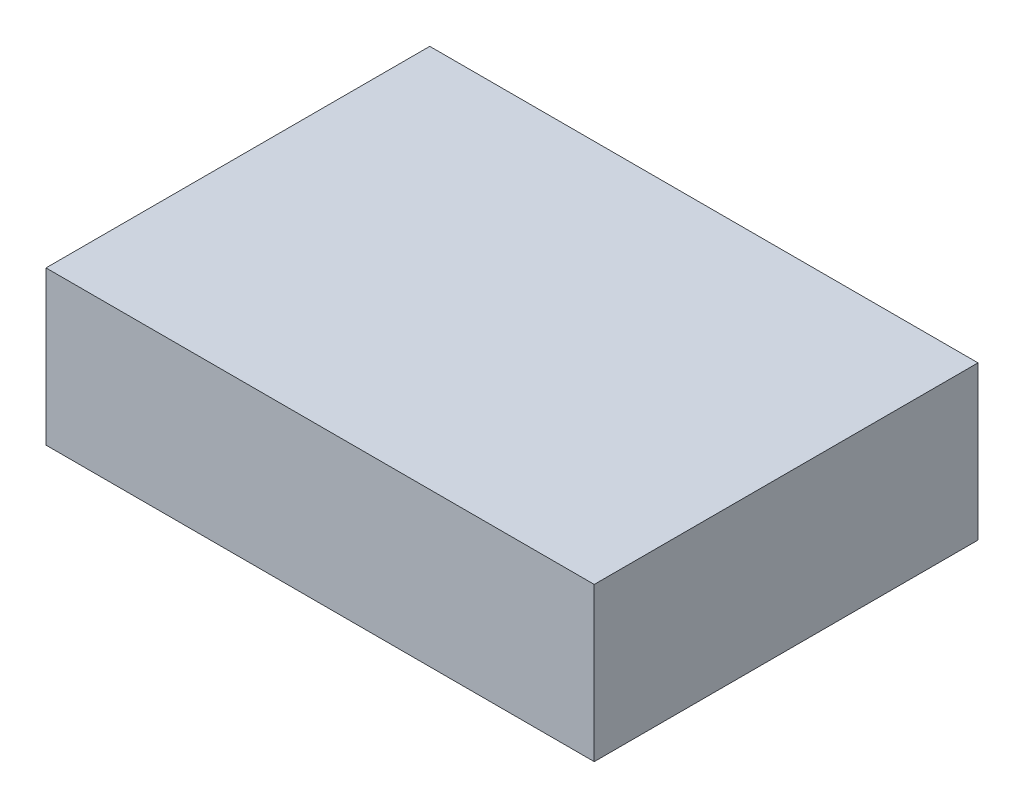
ISO-10303-21;
HEADER;
FILE_DESCRIPTION(('STEP AP214'),'2;1');
FILE_NAME('part.step','',(''),(''),'','','');
FILE_SCHEMA(('AUTOMOTIVE_DESIGN { 1 0 10303 214 1 1 1 1 }'));
ENDSEC;
DATA;
#1=APPLICATION_CONTEXT('core data for automotive mechanical design processes');
#2=APPLICATION_PROTOCOL_DEFINITION('international standard','automotive_design',2000,#1);
#3=PRODUCT_CONTEXT('',#1,'mechanical');
#4=PRODUCT('Part','Part','',(#3));
#5=PRODUCT_RELATED_PRODUCT_CATEGORY('part','',(#4));
#6=PRODUCT_DEFINITION_FORMATION('','',#4);
#7=PRODUCT_DEFINITION_CONTEXT('part definition',#1,'design');
#8=PRODUCT_DEFINITION('design','',#6,#7);
#9=PRODUCT_DEFINITION_SHAPE('','',#8);
#10=(LENGTH_UNIT() NAMED_UNIT(*) SI_UNIT(.MILLI.,.METRE.));
#11=(NAMED_UNIT(*) PLANE_ANGLE_UNIT() SI_UNIT($,.RADIAN.));
#12=(NAMED_UNIT(*) SI_UNIT($,.STERADIAN.) SOLID_ANGLE_UNIT());
#13=UNCERTAINTY_MEASURE_WITH_UNIT(LENGTH_MEASURE(1.E-05),#10,'distance_accuracy_value','');
#14=(GEOMETRIC_REPRESENTATION_CONTEXT(3) GLOBAL_UNCERTAINTY_ASSIGNED_CONTEXT((#13)) GLOBAL_UNIT_ASSIGNED_CONTEXT((#10,
#11,#12)) REPRESENTATION_CONTEXT('',''));
#15=CARTESIAN_POINT('',(0.,0.,0.));
#16=DIRECTION('',(0.,0.,1.));
#17=DIRECTION('',(1.,0.,0.));
#18=AXIS2_PLACEMENT_3D('',#15,#16,#17);
#19=CARTESIAN_POINT('',(0.,28.,0.));
#20=DIRECTION('',(1.,0.,0.));
#21=DIRECTION('',(0.,0.,-1.));
#22=AXIS2_PLACEMENT_3D('',#19,#20,#21);
#23=PLANE('',#22);
#24=DIRECTION('',(0.,0.,1.));
#25=VECTOR('',#24,1.);
#26=CARTESIAN_POINT('',(0.,0.,0.));
#27=LINE('',#26,#25);
#28=CARTESIAN_POINT('',(0.,0.,0.));
#29=VERTEX_POINT('',#28);
#30=CARTESIAN_POINT('',(0.,0.,70.));
#31=VERTEX_POINT('',#30);
#32=EDGE_CURVE('E96',#29,#31,#27,.T.);
#33=ORIENTED_EDGE('',*,*,#32,.T.);
#34=DIRECTION('',(0.,-1.,0.));
#35=VECTOR('',#34,1.);
#36=CARTESIAN_POINT('',(0.,28.,70.));
#37=LINE('',#36,#35);
#38=CARTESIAN_POINT('',(0.,28.,70.));
#39=VERTEX_POINT('',#38);
#40=EDGE_CURVE('E11',#39,#31,#37,.T.);
#41=ORIENTED_EDGE('',*,*,#40,.F.);
#42=DIRECTION('',(0.,0.,1.));
#43=VECTOR('',#42,1.);
#44=CARTESIAN_POINT('',(0.,28.,0.));
#45=LINE('',#44,#43);
#46=CARTESIAN_POINT('',(0.,28.,0.));
#47=VERTEX_POINT('',#46);
#48=EDGE_CURVE('E84',#47,#39,#45,.T.);
#49=ORIENTED_EDGE('',*,*,#48,.F.);
#50=DIRECTION('',(0.,-1.,0.));
#51=VECTOR('',#50,1.);
#52=CARTESIAN_POINT('',(0.,28.,0.));
#53=LINE('',#52,#51);
#54=EDGE_CURVE('E92',#47,#29,#53,.T.);
#55=ORIENTED_EDGE('',*,*,#54,.T.);
#56=EDGE_LOOP('',(#33,#41,#49,#55));
#57=FACE_BOUND('',#56,.T.);
#58=ADVANCED_FACE('F33',(#57),#23,.F.);
#59=CARTESIAN_POINT('',(0.,28.,70.));
#60=DIRECTION('',(0.,0.,-1.));
#61=DIRECTION('',(-1.,0.,0.));
#62=AXIS2_PLACEMENT_3D('',#59,#60,#61);
#63=PLANE('',#62);
#64=DIRECTION('',(1.,0.,0.));
#65=VECTOR('',#64,1.);
#66=CARTESIAN_POINT('',(0.,0.,70.));
#67=LINE('',#66,#65);
#68=CARTESIAN_POINT('',(100.,0.,70.));
#69=VERTEX_POINT('',#68);
#70=EDGE_CURVE('E88',#31,#69,#67,.T.);
#71=ORIENTED_EDGE('',*,*,#70,.T.);
#72=DIRECTION('',(0.,-1.,0.));
#73=VECTOR('',#72,1.);
#74=CARTESIAN_POINT('',(100.,28.,70.));
#75=LINE('',#74,#73);
#76=CARTESIAN_POINT('',(100.,28.,70.));
#77=VERTEX_POINT('',#76);
#78=EDGE_CURVE('E41',#77,#69,#75,.T.);
#79=ORIENTED_EDGE('',*,*,#78,.F.);
#80=DIRECTION('',(1.,0.,0.));
#81=VECTOR('',#80,1.);
#82=CARTESIAN_POINT('',(0.,28.,70.));
#83=LINE('',#82,#81);
#84=EDGE_CURVE('E79',#39,#77,#83,.T.);
#85=ORIENTED_EDGE('',*,*,#84,.F.);
#86=ORIENTED_EDGE('',*,*,#40,.T.);
#87=EDGE_LOOP('',(#71,#79,#85,#86));
#88=FACE_BOUND('',#87,.T.);
#89=ADVANCED_FACE('F87',(#88),#63,.F.);
#90=CARTESIAN_POINT('',(100.,28.,0.));
#91=DIRECTION('',(-1.,0.,0.));
#92=DIRECTION('',(0.,0.,1.));
#93=AXIS2_PLACEMENT_3D('',#90,#91,#92);
#94=PLANE('',#93);
#95=DIRECTION('',(0.,0.,-1.));
#96=VECTOR('',#95,1.);
#97=CARTESIAN_POINT('',(100.,0.,0.));
#98=LINE('',#97,#96);
#99=CARTESIAN_POINT('',(100.,0.,0.));
#100=VERTEX_POINT('',#99);
#101=EDGE_CURVE('E66',#69,#100,#98,.T.);
#102=ORIENTED_EDGE('',*,*,#101,.T.);
#103=DIRECTION('',(0.,-1.,0.));
#104=VECTOR('',#103,1.);
#105=CARTESIAN_POINT('',(100.,28.,0.));
#106=LINE('',#105,#104);
#107=CARTESIAN_POINT('',(100.,28.,0.));
#108=VERTEX_POINT('',#107);
#109=EDGE_CURVE('E89',#108,#100,#106,.T.);
#110=ORIENTED_EDGE('',*,*,#109,.F.);
#111=DIRECTION('',(0.,0.,-1.));
#112=VECTOR('',#111,1.);
#113=CARTESIAN_POINT('',(100.,28.,0.));
#114=LINE('',#113,#112);
#115=EDGE_CURVE('E82',#77,#108,#114,.T.);
#116=ORIENTED_EDGE('',*,*,#115,.F.);
#117=ORIENTED_EDGE('',*,*,#78,.T.);
#118=EDGE_LOOP('',(#102,#110,#116,#117));
#119=FACE_BOUND('',#118,.T.);
#120=ADVANCED_FACE('F90',(#119),#94,.F.);
#121=CARTESIAN_POINT('',(0.,28.,0.));
#122=DIRECTION('',(0.,0.,1.));
#123=DIRECTION('',(1.,0.,0.));
#124=AXIS2_PLACEMENT_3D('',#121,#122,#123);
#125=PLANE('',#124);
#126=DIRECTION('',(-1.,0.,0.));
#127=VECTOR('',#126,1.);
#128=CARTESIAN_POINT('',(0.,0.,0.));
#129=LINE('',#128,#127);
#130=EDGE_CURVE('E72',#100,#29,#129,.T.);
#131=ORIENTED_EDGE('',*,*,#130,.T.);
#132=ORIENTED_EDGE('',*,*,#54,.F.);
#133=DIRECTION('',(-1.,0.,0.));
#134=VECTOR('',#133,1.);
#135=CARTESIAN_POINT('',(0.,28.,0.));
#136=LINE('',#135,#134);
#137=EDGE_CURVE('E49',#108,#47,#136,.T.);
#138=ORIENTED_EDGE('',*,*,#137,.F.);
#139=ORIENTED_EDGE('',*,*,#109,.T.);
#140=EDGE_LOOP('',(#131,#132,#138,#139));
#141=FACE_BOUND('',#140,.T.);
#142=ADVANCED_FACE('F103',(#141),#125,.F.);
#143=CARTESIAN_POINT('',(0.,28.,0.));
#144=DIRECTION('',(0.,1.,0.));
#145=DIRECTION('',(0.,0.,1.));
#146=AXIS2_PLACEMENT_3D('',#143,#144,#145);
#147=PLANE('',#146);
#148=ORIENTED_EDGE('',*,*,#48,.T.);
#149=ORIENTED_EDGE('',*,*,#84,.T.);
#150=ORIENTED_EDGE('',*,*,#115,.T.);
#151=ORIENTED_EDGE('',*,*,#137,.T.);
#152=EDGE_LOOP('',(#148,#149,#150,#151));
#153=FACE_BOUND('',#152,.T.);
#154=ADVANCED_FACE('F80',(#153),#147,.T.);
#155=CARTESIAN_POINT('',(0.,0.,0.));
#156=DIRECTION('',(0.,1.,0.));
#157=DIRECTION('',(0.,0.,1.));
#158=AXIS2_PLACEMENT_3D('',#155,#156,#157);
#159=PLANE('',#158);
#160=ORIENTED_EDGE('',*,*,#32,.F.);
#161=ORIENTED_EDGE('',*,*,#130,.F.);
#162=ORIENTED_EDGE('',*,*,#101,.F.);
#163=ORIENTED_EDGE('',*,*,#70,.F.);
#164=EDGE_LOOP('',(#160,#161,#162,#163));
#165=FACE_BOUND('',#164,.T.);
#166=ADVANCED_FACE('F106',(#165),#159,.F.);
#167=CLOSED_SHELL('',(#58,#89,#120,#142,#154,#166));
#168=MANIFOLD_SOLID_BREP('B2',#167);
#169=ADVANCED_BREP_SHAPE_REPRESENTATION('',(#18,#168),#14);
#170=SHAPE_DEFINITION_REPRESENTATION(#9,#169);
ENDSEC;
END-ISO-10303-21;
